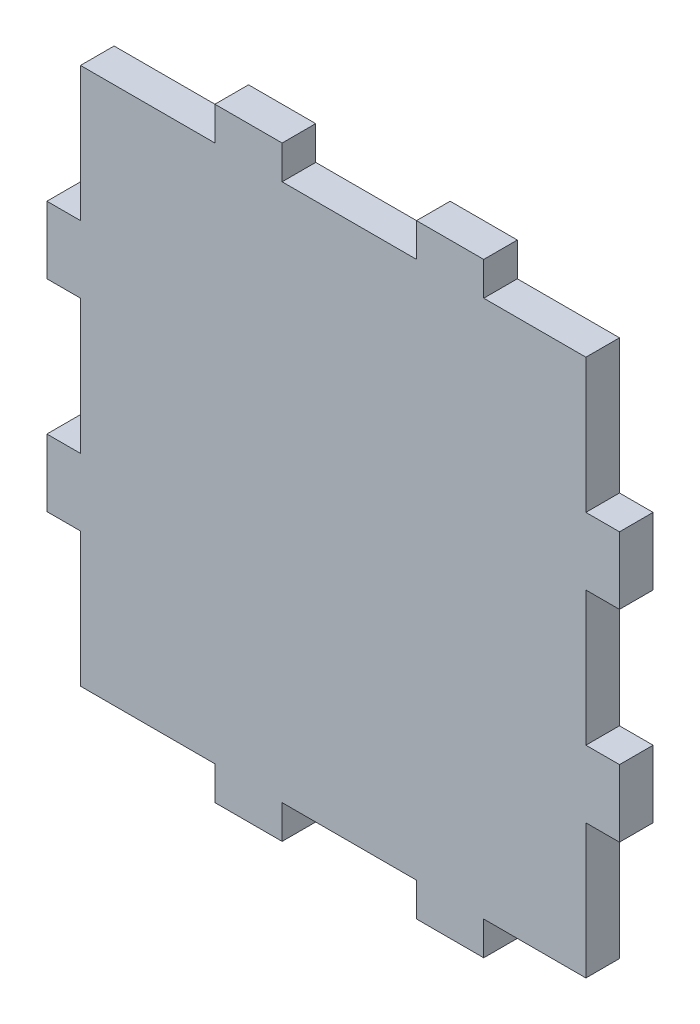
ISO-10303-21;
HEADER;
FILE_DESCRIPTION(('STEP AP214'),'2;1');
FILE_NAME('part.step','',(''),(''),'','','');
FILE_SCHEMA(('AUTOMOTIVE_DESIGN { 1 0 10303 214 1 1 1 1 }'));
ENDSEC;
DATA;
#1=APPLICATION_CONTEXT('core data for automotive mechanical design processes');
#2=APPLICATION_PROTOCOL_DEFINITION('international standard','automotive_design',2000,#1);
#3=PRODUCT_CONTEXT('',#1,'mechanical');
#4=PRODUCT('Part','Part','',(#3));
#5=PRODUCT_RELATED_PRODUCT_CATEGORY('part','',(#4));
#6=PRODUCT_DEFINITION_FORMATION('','',#4);
#7=PRODUCT_DEFINITION_CONTEXT('part definition',#1,'design');
#8=PRODUCT_DEFINITION('design','',#6,#7);
#9=PRODUCT_DEFINITION_SHAPE('','',#8);
#10=(LENGTH_UNIT() NAMED_UNIT(*) SI_UNIT(.MILLI.,.METRE.));
#11=(NAMED_UNIT(*) PLANE_ANGLE_UNIT() SI_UNIT($,.RADIAN.));
#12=(NAMED_UNIT(*) SI_UNIT($,.STERADIAN.) SOLID_ANGLE_UNIT());
#13=UNCERTAINTY_MEASURE_WITH_UNIT(LENGTH_MEASURE(1.E-05),#10,'distance_accuracy_value','');
#14=(GEOMETRIC_REPRESENTATION_CONTEXT(3) GLOBAL_UNCERTAINTY_ASSIGNED_CONTEXT((#13)) GLOBAL_UNIT_ASSIGNED_CONTEXT((#10,
#11,#12)) REPRESENTATION_CONTEXT('',''));
#15=CARTESIAN_POINT('',(0.,0.,0.));
#16=DIRECTION('',(0.,0.,1.));
#17=DIRECTION('',(1.,0.,0.));
#18=AXIS2_PLACEMENT_3D('',#15,#16,#17);
#19=CARTESIAN_POINT('',(-3.175,0.,3.175));
#20=DIRECTION('',(-1.,0.,0.));
#21=DIRECTION('',(0.,0.,1.));
#22=AXIS2_PLACEMENT_3D('',#19,#20,#21);
#23=PLANE('',#22);
#24=DIRECTION('',(0.,1.,0.));
#25=VECTOR('',#24,1.);
#26=CARTESIAN_POINT('',(-3.175,0.,0.));
#27=LINE('',#26,#25);
#28=CARTESIAN_POINT('',(-3.175,-19.05,0.));
#29=VERTEX_POINT('',#28);
#30=CARTESIAN_POINT('',(-3.175,-12.7,0.));
#31=VERTEX_POINT('',#30);
#32=EDGE_CURVE('E297',#29,#31,#27,.T.);
#33=ORIENTED_EDGE('',*,*,#32,.F.);
#34=DIRECTION('',(0.,0.,-1.));
#35=VECTOR('',#34,1.);
#36=CARTESIAN_POINT('',(-3.175,-19.05,3.175));
#37=LINE('',#36,#35);
#38=CARTESIAN_POINT('',(-3.175,-19.05,3.175));
#39=VERTEX_POINT('',#38);
#40=EDGE_CURVE('E11',#39,#29,#37,.T.);
#41=ORIENTED_EDGE('',*,*,#40,.F.);
#42=DIRECTION('',(0.,1.,0.));
#43=VECTOR('',#42,1.);
#44=CARTESIAN_POINT('',(-3.175,0.,3.175));
#45=LINE('',#44,#43);
#46=CARTESIAN_POINT('',(-3.175,-12.7,3.175));
#47=VERTEX_POINT('',#46);
#48=EDGE_CURVE('E394',#39,#47,#45,.T.);
#49=ORIENTED_EDGE('',*,*,#48,.T.);
#50=DIRECTION('',(0.,0.,-1.));
#51=VECTOR('',#50,1.);
#52=CARTESIAN_POINT('',(-3.175,-12.7,3.175));
#53=LINE('',#52,#51);
#54=EDGE_CURVE('E169',#47,#31,#53,.T.);
#55=ORIENTED_EDGE('',*,*,#54,.T.);
#56=EDGE_LOOP('',(#33,#41,#49,#55));
#57=FACE_BOUND('',#56,.T.);
#58=ADVANCED_FACE('F35',(#57),#23,.T.);
#59=CARTESIAN_POINT('',(0.,-19.05,3.175));
#60=DIRECTION('',(0.,-1.,0.));
#61=DIRECTION('',(1.,0.,0.));
#62=AXIS2_PLACEMENT_3D('',#59,#60,#61);
#63=PLANE('',#62);
#64=DIRECTION('',(-1.,0.,0.));
#65=VECTOR('',#64,1.);
#66=CARTESIAN_POINT('',(0.,-19.05,0.));
#67=LINE('',#66,#65);
#68=CARTESIAN_POINT('',(0.,-19.05,0.));
#69=VERTEX_POINT('',#68);
#70=EDGE_CURVE('E300',#69,#29,#67,.T.);
#71=ORIENTED_EDGE('',*,*,#70,.F.);
#72=DIRECTION('',(0.,0.,-1.));
#73=VECTOR('',#72,1.);
#74=CARTESIAN_POINT('',(0.,-19.05,3.175));
#75=LINE('',#74,#73);
#76=CARTESIAN_POINT('',(0.,-19.05,3.175));
#77=VERTEX_POINT('',#76);
#78=EDGE_CURVE('E43',#77,#69,#75,.T.);
#79=ORIENTED_EDGE('',*,*,#78,.F.);
#80=DIRECTION('',(-1.,0.,0.));
#81=VECTOR('',#80,1.);
#82=CARTESIAN_POINT('',(0.,-19.05,3.175));
#83=LINE('',#82,#81);
#84=EDGE_CURVE('E477',#77,#39,#83,.T.);
#85=ORIENTED_EDGE('',*,*,#84,.T.);
#86=ORIENTED_EDGE('',*,*,#40,.T.);
#87=EDGE_LOOP('',(#71,#79,#85,#86));
#88=FACE_BOUND('',#87,.T.);
#89=ADVANCED_FACE('F476',(#88),#63,.T.);
#90=CARTESIAN_POINT('',(0.,0.,3.175));
#91=DIRECTION('',(1.,0.,0.));
#92=DIRECTION('',(0.,1.,0.));
#93=AXIS2_PLACEMENT_3D('',#90,#91,#92);
#94=PLANE('',#93);
#95=DIRECTION('',(0.,-1.,0.));
#96=VECTOR('',#95,1.);
#97=CARTESIAN_POINT('',(0.,0.,0.));
#98=LINE('',#97,#96);
#99=CARTESIAN_POINT('',(0.,-31.75,0.));
#100=VERTEX_POINT('',#99);
#101=EDGE_CURVE('E303',#69,#100,#98,.T.);
#102=ORIENTED_EDGE('',*,*,#101,.T.);
#103=DIRECTION('',(0.,0.,-1.));
#104=VECTOR('',#103,1.);
#105=CARTESIAN_POINT('',(0.,-31.75,3.175));
#106=LINE('',#105,#104);
#107=CARTESIAN_POINT('',(0.,-31.75,3.175));
#108=VERTEX_POINT('',#107);
#109=EDGE_CURVE('E461',#108,#100,#106,.T.);
#110=ORIENTED_EDGE('',*,*,#109,.F.);
#111=DIRECTION('',(0.,-1.,0.));
#112=VECTOR('',#111,1.);
#113=CARTESIAN_POINT('',(0.,0.,3.175));
#114=LINE('',#113,#112);
#115=EDGE_CURVE('E468',#77,#108,#114,.T.);
#116=ORIENTED_EDGE('',*,*,#115,.F.);
#117=ORIENTED_EDGE('',*,*,#78,.T.);
#118=EDGE_LOOP('',(#102,#110,#116,#117));
#119=FACE_BOUND('',#118,.T.);
#120=ADVANCED_FACE('F466',(#119),#94,.F.);
#121=CARTESIAN_POINT('',(0.,-31.75,3.175));
#122=DIRECTION('',(0.,-1.,0.));
#123=DIRECTION('',(0.,0.,-1.));
#124=AXIS2_PLACEMENT_3D('',#121,#122,#123);
#125=PLANE('',#124);
#126=DIRECTION('',(-1.,0.,0.));
#127=VECTOR('',#126,1.);
#128=CARTESIAN_POINT('',(0.,-31.75,0.));
#129=LINE('',#128,#127);
#130=CARTESIAN_POINT('',(-3.175,-31.75,0.));
#131=VERTEX_POINT('',#130);
#132=EDGE_CURVE('E305',#100,#131,#129,.T.);
#133=ORIENTED_EDGE('',*,*,#132,.T.);
#134=DIRECTION('',(0.,0.,-1.));
#135=VECTOR('',#134,1.);
#136=CARTESIAN_POINT('',(-3.175,-31.75,3.175));
#137=LINE('',#136,#135);
#138=CARTESIAN_POINT('',(-3.175,-31.75,3.175));
#139=VERTEX_POINT('',#138);
#140=EDGE_CURVE('E459',#139,#131,#137,.T.);
#141=ORIENTED_EDGE('',*,*,#140,.F.);
#142=DIRECTION('',(-1.,0.,0.));
#143=VECTOR('',#142,1.);
#144=CARTESIAN_POINT('',(0.,-31.75,3.175));
#145=LINE('',#144,#143);
#146=EDGE_CURVE('E485',#108,#139,#145,.T.);
#147=ORIENTED_EDGE('',*,*,#146,.F.);
#148=ORIENTED_EDGE('',*,*,#109,.T.);
#149=EDGE_LOOP('',(#133,#141,#147,#148));
#150=FACE_BOUND('',#149,.T.);
#151=ADVANCED_FACE('F681',(#150),#125,.F.);
#152=CARTESIAN_POINT('',(-3.175,0.,3.175));
#153=DIRECTION('',(-1.,0.,0.));
#154=DIRECTION('',(0.,0.,1.));
#155=AXIS2_PLACEMENT_3D('',#152,#153,#154);
#156=PLANE('',#155);
#157=DIRECTION('',(0.,1.,0.));
#158=VECTOR('',#157,1.);
#159=CARTESIAN_POINT('',(-3.175,0.,0.));
#160=LINE('',#159,#158);
#161=CARTESIAN_POINT('',(-3.175,-38.1,0.));
#162=VERTEX_POINT('',#161);
#163=EDGE_CURVE('E308',#162,#131,#160,.T.);
#164=ORIENTED_EDGE('',*,*,#163,.F.);
#165=DIRECTION('',(0.,0.,-1.));
#166=VECTOR('',#165,1.);
#167=CARTESIAN_POINT('',(-3.175,-38.1,3.175));
#168=LINE('',#167,#166);
#169=CARTESIAN_POINT('',(-3.175,-38.1,3.175));
#170=VERTEX_POINT('',#169);
#171=EDGE_CURVE('E457',#170,#162,#168,.T.);
#172=ORIENTED_EDGE('',*,*,#171,.F.);
#173=DIRECTION('',(0.,1.,0.));
#174=VECTOR('',#173,1.);
#175=CARTESIAN_POINT('',(-3.175,0.,3.175));
#176=LINE('',#175,#174);
#177=EDGE_CURVE('E487',#170,#139,#176,.T.);
#178=ORIENTED_EDGE('',*,*,#177,.T.);
#179=ORIENTED_EDGE('',*,*,#140,.T.);
#180=EDGE_LOOP('',(#164,#172,#178,#179));
#181=FACE_BOUND('',#180,.T.);
#182=ADVANCED_FACE('F677',(#181),#156,.T.);
#183=CARTESIAN_POINT('',(0.,-38.1,3.175));
#184=DIRECTION('',(0.,-1.,0.));
#185=DIRECTION('',(0.,0.,-1.));
#186=AXIS2_PLACEMENT_3D('',#183,#184,#185);
#187=PLANE('',#186);
#188=DIRECTION('',(-1.,0.,0.));
#189=VECTOR('',#188,1.);
#190=CARTESIAN_POINT('',(0.,-38.1,0.));
#191=LINE('',#190,#189);
#192=CARTESIAN_POINT('',(0.,-38.1,0.));
#193=VERTEX_POINT('',#192);
#194=EDGE_CURVE('E311',#193,#162,#191,.T.);
#195=ORIENTED_EDGE('',*,*,#194,.F.);
#196=DIRECTION('',(0.,0.,-1.));
#197=VECTOR('',#196,1.);
#198=CARTESIAN_POINT('',(0.,-38.1,3.175));
#199=LINE('',#198,#197);
#200=CARTESIAN_POINT('',(0.,-38.1,3.175));
#201=VERTEX_POINT('',#200);
#202=EDGE_CURVE('E455',#201,#193,#199,.T.);
#203=ORIENTED_EDGE('',*,*,#202,.F.);
#204=DIRECTION('',(-1.,0.,0.));
#205=VECTOR('',#204,1.);
#206=CARTESIAN_POINT('',(0.,-38.1,3.175));
#207=LINE('',#206,#205);
#208=EDGE_CURVE('E490',#201,#170,#207,.T.);
#209=ORIENTED_EDGE('',*,*,#208,.T.);
#210=ORIENTED_EDGE('',*,*,#171,.T.);
#211=EDGE_LOOP('',(#195,#203,#209,#210));
#212=FACE_BOUND('',#211,.T.);
#213=ADVANCED_FACE('F671',(#212),#187,.T.);
#214=CARTESIAN_POINT('',(0.,0.,3.175));
#215=DIRECTION('',(1.,0.,0.));
#216=DIRECTION('',(0.,1.,0.));
#217=AXIS2_PLACEMENT_3D('',#214,#215,#216);
#218=PLANE('',#217);
#219=DIRECTION('',(0.,-1.,0.));
#220=VECTOR('',#219,1.);
#221=CARTESIAN_POINT('',(0.,0.,0.));
#222=LINE('',#221,#220);
#223=CARTESIAN_POINT('',(0.,-50.8,0.));
#224=VERTEX_POINT('',#223);
#225=EDGE_CURVE('E314',#193,#224,#222,.T.);
#226=ORIENTED_EDGE('',*,*,#225,.T.);
#227=DIRECTION('',(0.,0.,-1.));
#228=VECTOR('',#227,1.);
#229=CARTESIAN_POINT('',(0.,-50.8,3.175));
#230=LINE('',#229,#228);
#231=CARTESIAN_POINT('',(0.,-50.8,3.175));
#232=VERTEX_POINT('',#231);
#233=EDGE_CURVE('E452',#232,#224,#230,.T.);
#234=ORIENTED_EDGE('',*,*,#233,.F.);
#235=DIRECTION('',(0.,-1.,0.));
#236=VECTOR('',#235,1.);
#237=CARTESIAN_POINT('',(0.,0.,3.175));
#238=LINE('',#237,#236);
#239=EDGE_CURVE('E493',#201,#232,#238,.T.);
#240=ORIENTED_EDGE('',*,*,#239,.F.);
#241=ORIENTED_EDGE('',*,*,#202,.T.);
#242=EDGE_LOOP('',(#226,#234,#240,#241));
#243=FACE_BOUND('',#242,.T.);
#244=ADVANCED_FACE('F682',(#243),#218,.F.);
#245=CARTESIAN_POINT('',(0.,-50.8,3.175));
#246=DIRECTION('',(0.,1.,0.));
#247=DIRECTION('',(-1.,0.,0.));
#248=AXIS2_PLACEMENT_3D('',#245,#246,#247);
#249=PLANE('',#248);
#250=DIRECTION('',(1.,0.,0.));
#251=VECTOR('',#250,1.);
#252=CARTESIAN_POINT('',(0.,-50.8,0.));
#253=LINE('',#252,#251);
#254=CARTESIAN_POINT('',(12.7,-50.8,0.));
#255=VERTEX_POINT('',#254);
#256=EDGE_CURVE('E316',#224,#255,#253,.T.);
#257=ORIENTED_EDGE('',*,*,#256,.T.);
#258=DIRECTION('',(0.,0.,-1.));
#259=VECTOR('',#258,1.);
#260=CARTESIAN_POINT('',(12.7,-50.8,3.175));
#261=LINE('',#260,#259);
#262=CARTESIAN_POINT('',(12.7,-50.8,3.175));
#263=VERTEX_POINT('',#262);
#264=EDGE_CURVE('E449',#263,#255,#261,.T.);
#265=ORIENTED_EDGE('',*,*,#264,.F.);
#266=DIRECTION('',(1.,0.,0.));
#267=VECTOR('',#266,1.);
#268=CARTESIAN_POINT('',(0.,-50.8,3.175));
#269=LINE('',#268,#267);
#270=EDGE_CURVE('E495',#232,#263,#269,.T.);
#271=ORIENTED_EDGE('',*,*,#270,.F.);
#272=ORIENTED_EDGE('',*,*,#233,.T.);
#273=EDGE_LOOP('',(#257,#265,#271,#272));
#274=FACE_BOUND('',#273,.T.);
#275=ADVANCED_FACE('F665',(#274),#249,.F.);
#276=CARTESIAN_POINT('',(12.7,0.,3.175));
#277=DIRECTION('',(1.,0.,0.));
#278=DIRECTION('',(0.,0.,-1.));
#279=AXIS2_PLACEMENT_3D('',#276,#277,#278);
#280=PLANE('',#279);
#281=DIRECTION('',(0.,-1.,0.));
#282=VECTOR('',#281,1.);
#283=CARTESIAN_POINT('',(12.7,0.,0.));
#284=LINE('',#283,#282);
#285=CARTESIAN_POINT('',(12.7,-53.975,0.));
#286=VERTEX_POINT('',#285);
#287=EDGE_CURVE('E318',#255,#286,#284,.T.);
#288=ORIENTED_EDGE('',*,*,#287,.T.);
#289=DIRECTION('',(0.,0.,-1.));
#290=VECTOR('',#289,1.);
#291=CARTESIAN_POINT('',(12.7,-53.975,3.175));
#292=LINE('',#291,#290);
#293=CARTESIAN_POINT('',(12.7,-53.975,3.175));
#294=VERTEX_POINT('',#293);
#295=EDGE_CURVE('E446',#294,#286,#292,.T.);
#296=ORIENTED_EDGE('',*,*,#295,.F.);
#297=DIRECTION('',(0.,-1.,0.));
#298=VECTOR('',#297,1.);
#299=CARTESIAN_POINT('',(12.7,0.,3.175));
#300=LINE('',#299,#298);
#301=EDGE_CURVE('E497',#263,#294,#300,.T.);
#302=ORIENTED_EDGE('',*,*,#301,.F.);
#303=ORIENTED_EDGE('',*,*,#264,.T.);
#304=EDGE_LOOP('',(#288,#296,#302,#303));
#305=FACE_BOUND('',#304,.T.);
#306=ADVANCED_FACE('F661',(#305),#280,.F.);
#307=CARTESIAN_POINT('',(0.,-53.975,3.175));
#308=DIRECTION('',(0.,1.,0.));
#309=DIRECTION('',(0.,0.,1.));
#310=AXIS2_PLACEMENT_3D('',#307,#308,#309);
#311=PLANE('',#310);
#312=DIRECTION('',(1.,0.,0.));
#313=VECTOR('',#312,1.);
#314=CARTESIAN_POINT('',(0.,-53.975,0.));
#315=LINE('',#314,#313);
#316=CARTESIAN_POINT('',(19.05,-53.975,0.));
#317=VERTEX_POINT('',#316);
#318=EDGE_CURVE('E320',#286,#317,#315,.T.);
#319=ORIENTED_EDGE('',*,*,#318,.T.);
#320=DIRECTION('',(0.,0.,-1.));
#321=VECTOR('',#320,1.);
#322=CARTESIAN_POINT('',(19.05,-53.975,3.175));
#323=LINE('',#322,#321);
#324=CARTESIAN_POINT('',(19.05,-53.975,3.175));
#325=VERTEX_POINT('',#324);
#326=EDGE_CURVE('E444',#325,#317,#323,.T.);
#327=ORIENTED_EDGE('',*,*,#326,.F.);
#328=DIRECTION('',(1.,0.,0.));
#329=VECTOR('',#328,1.);
#330=CARTESIAN_POINT('',(0.,-53.975,3.175));
#331=LINE('',#330,#329);
#332=EDGE_CURVE('E499',#294,#325,#331,.T.);
#333=ORIENTED_EDGE('',*,*,#332,.F.);
#334=ORIENTED_EDGE('',*,*,#295,.T.);
#335=EDGE_LOOP('',(#319,#327,#333,#334));
#336=FACE_BOUND('',#335,.T.);
#337=ADVANCED_FACE('F656',(#336),#311,.F.);
#338=CARTESIAN_POINT('',(19.05,0.,3.175));
#339=DIRECTION('',(1.,0.,0.));
#340=DIRECTION('',(0.,0.,-1.));
#341=AXIS2_PLACEMENT_3D('',#338,#339,#340);
#342=PLANE('',#341);
#343=DIRECTION('',(0.,-1.,0.));
#344=VECTOR('',#343,1.);
#345=CARTESIAN_POINT('',(19.05,0.,0.));
#346=LINE('',#345,#344);
#347=CARTESIAN_POINT('',(19.05,-50.8,0.));
#348=VERTEX_POINT('',#347);
#349=EDGE_CURVE('E323',#348,#317,#346,.T.);
#350=ORIENTED_EDGE('',*,*,#349,.F.);
#351=DIRECTION('',(0.,0.,-1.));
#352=VECTOR('',#351,1.);
#353=CARTESIAN_POINT('',(19.05,-50.8,3.175));
#354=LINE('',#353,#352);
#355=CARTESIAN_POINT('',(19.05,-50.8,3.175));
#356=VERTEX_POINT('',#355);
#357=EDGE_CURVE('E442',#356,#348,#354,.T.);
#358=ORIENTED_EDGE('',*,*,#357,.F.);
#359=DIRECTION('',(0.,-1.,0.));
#360=VECTOR('',#359,1.);
#361=CARTESIAN_POINT('',(19.05,0.,3.175));
#362=LINE('',#361,#360);
#363=EDGE_CURVE('E501',#356,#325,#362,.T.);
#364=ORIENTED_EDGE('',*,*,#363,.T.);
#365=ORIENTED_EDGE('',*,*,#326,.T.);
#366=EDGE_LOOP('',(#350,#358,#364,#365));
#367=FACE_BOUND('',#366,.T.);
#368=ADVANCED_FACE('F650',(#367),#342,.T.);
#369=CARTESIAN_POINT('',(0.,-50.8,3.175));
#370=DIRECTION('',(0.,1.,0.));
#371=DIRECTION('',(-1.,0.,0.));
#372=AXIS2_PLACEMENT_3D('',#369,#370,#371);
#373=PLANE('',#372);
#374=DIRECTION('',(1.,0.,0.));
#375=VECTOR('',#374,1.);
#376=CARTESIAN_POINT('',(0.,-50.8,0.));
#377=LINE('',#376,#375);
#378=CARTESIAN_POINT('',(31.75,-50.8,0.));
#379=VERTEX_POINT('',#378);
#380=EDGE_CURVE('E326',#348,#379,#377,.T.);
#381=ORIENTED_EDGE('',*,*,#380,.T.);
#382=DIRECTION('',(0.,0.,-1.));
#383=VECTOR('',#382,1.);
#384=CARTESIAN_POINT('',(31.75,-50.8,3.175));
#385=LINE('',#384,#383);
#386=CARTESIAN_POINT('',(31.75,-50.8,3.175));
#387=VERTEX_POINT('',#386);
#388=EDGE_CURVE('E439',#387,#379,#385,.T.);
#389=ORIENTED_EDGE('',*,*,#388,.F.);
#390=DIRECTION('',(1.,0.,0.));
#391=VECTOR('',#390,1.);
#392=CARTESIAN_POINT('',(0.,-50.8,3.175));
#393=LINE('',#392,#391);
#394=EDGE_CURVE('E504',#356,#387,#393,.T.);
#395=ORIENTED_EDGE('',*,*,#394,.F.);
#396=ORIENTED_EDGE('',*,*,#357,.T.);
#397=EDGE_LOOP('',(#381,#389,#395,#396));
#398=FACE_BOUND('',#397,.T.);
#399=ADVANCED_FACE('F647',(#398),#373,.F.);
#400=CARTESIAN_POINT('',(31.75,0.,3.175));
#401=DIRECTION('',(1.,0.,0.));
#402=DIRECTION('',(0.,0.,-1.));
#403=AXIS2_PLACEMENT_3D('',#400,#401,#402);
#404=PLANE('',#403);
#405=DIRECTION('',(0.,-1.,0.));
#406=VECTOR('',#405,1.);
#407=CARTESIAN_POINT('',(31.75,0.,0.));
#408=LINE('',#407,#406);
#409=CARTESIAN_POINT('',(31.75,-53.975,0.));
#410=VERTEX_POINT('',#409);
#411=EDGE_CURVE('E328',#379,#410,#408,.T.);
#412=ORIENTED_EDGE('',*,*,#411,.T.);
#413=DIRECTION('',(0.,0.,-1.));
#414=VECTOR('',#413,1.);
#415=CARTESIAN_POINT('',(31.75,-53.975,3.175));
#416=LINE('',#415,#414);
#417=CARTESIAN_POINT('',(31.75,-53.975,3.175));
#418=VERTEX_POINT('',#417);
#419=EDGE_CURVE('E436',#418,#410,#416,.T.);
#420=ORIENTED_EDGE('',*,*,#419,.F.);
#421=DIRECTION('',(0.,-1.,0.));
#422=VECTOR('',#421,1.);
#423=CARTESIAN_POINT('',(31.75,0.,3.175));
#424=LINE('',#423,#422);
#425=EDGE_CURVE('E506',#387,#418,#424,.T.);
#426=ORIENTED_EDGE('',*,*,#425,.F.);
#427=ORIENTED_EDGE('',*,*,#388,.T.);
#428=EDGE_LOOP('',(#412,#420,#426,#427));
#429=FACE_BOUND('',#428,.T.);
#430=ADVANCED_FACE('F642',(#429),#404,.F.);
#431=CARTESIAN_POINT('',(0.,-53.975,3.175));
#432=DIRECTION('',(0.,1.,0.));
#433=DIRECTION('',(0.,0.,1.));
#434=AXIS2_PLACEMENT_3D('',#431,#432,#433);
#435=PLANE('',#434);
#436=DIRECTION('',(1.,0.,0.));
#437=VECTOR('',#436,1.);
#438=CARTESIAN_POINT('',(0.,-53.975,0.));
#439=LINE('',#438,#437);
#440=CARTESIAN_POINT('',(38.1,-53.975,0.));
#441=VERTEX_POINT('',#440);
#442=EDGE_CURVE('E330',#410,#441,#439,.T.);
#443=ORIENTED_EDGE('',*,*,#442,.T.);
#444=DIRECTION('',(0.,0.,-1.));
#445=VECTOR('',#444,1.);
#446=CARTESIAN_POINT('',(38.1,-53.975,3.175));
#447=LINE('',#446,#445);
#448=CARTESIAN_POINT('',(38.1,-53.975,3.175));
#449=VERTEX_POINT('',#448);
#450=EDGE_CURVE('E434',#449,#441,#447,.T.);
#451=ORIENTED_EDGE('',*,*,#450,.F.);
#452=DIRECTION('',(1.,0.,0.));
#453=VECTOR('',#452,1.);
#454=CARTESIAN_POINT('',(0.,-53.975,3.175));
#455=LINE('',#454,#453);
#456=EDGE_CURVE('E508',#418,#449,#455,.T.);
#457=ORIENTED_EDGE('',*,*,#456,.F.);
#458=ORIENTED_EDGE('',*,*,#419,.T.);
#459=EDGE_LOOP('',(#443,#451,#457,#458));
#460=FACE_BOUND('',#459,.T.);
#461=ADVANCED_FACE('F636',(#460),#435,.F.);
#462=CARTESIAN_POINT('',(38.1,0.,3.175));
#463=DIRECTION('',(1.,0.,0.));
#464=DIRECTION('',(0.,0.,-1.));
#465=AXIS2_PLACEMENT_3D('',#462,#463,#464);
#466=PLANE('',#465);
#467=DIRECTION('',(0.,-1.,0.));
#468=VECTOR('',#467,1.);
#469=CARTESIAN_POINT('',(38.1,0.,0.));
#470=LINE('',#469,#468);
#471=CARTESIAN_POINT('',(38.1,-50.8,0.));
#472=VERTEX_POINT('',#471);
#473=EDGE_CURVE('E333',#472,#441,#470,.T.);
#474=ORIENTED_EDGE('',*,*,#473,.F.);
#475=DIRECTION('',(0.,0.,-1.));
#476=VECTOR('',#475,1.);
#477=CARTESIAN_POINT('',(38.1,-50.8,3.175));
#478=LINE('',#477,#476);
#479=CARTESIAN_POINT('',(38.1,-50.8,3.175));
#480=VERTEX_POINT('',#479);
#481=EDGE_CURVE('E432',#480,#472,#478,.T.);
#482=ORIENTED_EDGE('',*,*,#481,.F.);
#483=DIRECTION('',(0.,-1.,0.));
#484=VECTOR('',#483,1.);
#485=CARTESIAN_POINT('',(38.1,0.,3.175));
#486=LINE('',#485,#484);
#487=EDGE_CURVE('E510',#480,#449,#486,.T.);
#488=ORIENTED_EDGE('',*,*,#487,.T.);
#489=ORIENTED_EDGE('',*,*,#450,.T.);
#490=EDGE_LOOP('',(#474,#482,#488,#489));
#491=FACE_BOUND('',#490,.T.);
#492=ADVANCED_FACE('F630',(#491),#466,.T.);
#493=CARTESIAN_POINT('',(0.,-50.8,3.175));
#494=DIRECTION('',(0.,1.,0.));
#495=DIRECTION('',(0.,0.,1.));
#496=AXIS2_PLACEMENT_3D('',#493,#494,#495);
#497=PLANE('',#496);
#498=DIRECTION('',(1.,0.,0.));
#499=VECTOR('',#498,1.);
#500=CARTESIAN_POINT('',(0.,-50.8,0.));
#501=LINE('',#500,#499);
#502=CARTESIAN_POINT('',(47.752,-50.8,0.));
#503=VERTEX_POINT('',#502);
#504=EDGE_CURVE('E336',#472,#503,#501,.T.);
#505=ORIENTED_EDGE('',*,*,#504,.T.);
#506=DIRECTION('',(0.,0.,-1.));
#507=VECTOR('',#506,1.);
#508=CARTESIAN_POINT('',(47.752,-50.8,3.175));
#509=LINE('',#508,#507);
#510=CARTESIAN_POINT('',(47.752,-50.8,3.175));
#511=VERTEX_POINT('',#510);
#512=EDGE_CURVE('E430',#511,#503,#509,.T.);
#513=ORIENTED_EDGE('',*,*,#512,.F.);
#514=DIRECTION('',(1.,0.,0.));
#515=VECTOR('',#514,1.);
#516=CARTESIAN_POINT('',(0.,-50.8,3.175));
#517=LINE('',#516,#515);
#518=EDGE_CURVE('E513',#480,#511,#517,.T.);
#519=ORIENTED_EDGE('',*,*,#518,.F.);
#520=ORIENTED_EDGE('',*,*,#481,.T.);
#521=EDGE_LOOP('',(#505,#513,#519,#520));
#522=FACE_BOUND('',#521,.T.);
#523=ADVANCED_FACE('F778',(#522),#497,.F.);
#524=CARTESIAN_POINT('',(47.752,0.,3.175));
#525=DIRECTION('',(1.,0.,0.));
#526=DIRECTION('',(0.,0.,-1.));
#527=AXIS2_PLACEMENT_3D('',#524,#525,#526);
#528=PLANE('',#527);
#529=DIRECTION('',(0.,-1.,0.));
#530=VECTOR('',#529,1.);
#531=CARTESIAN_POINT('',(47.752,0.,0.));
#532=LINE('',#531,#530);
#533=CARTESIAN_POINT('',(47.752,-38.1,0.));
#534=VERTEX_POINT('',#533);
#535=EDGE_CURVE('E339',#534,#503,#532,.T.);
#536=ORIENTED_EDGE('',*,*,#535,.F.);
#537=DIRECTION('',(0.,0.,-1.));
#538=VECTOR('',#537,1.);
#539=CARTESIAN_POINT('',(47.752,-38.1,3.175));
#540=LINE('',#539,#538);
#541=CARTESIAN_POINT('',(47.752,-38.1,3.175));
#542=VERTEX_POINT('',#541);
#543=EDGE_CURVE('E428',#542,#534,#540,.T.);
#544=ORIENTED_EDGE('',*,*,#543,.F.);
#545=DIRECTION('',(0.,-1.,0.));
#546=VECTOR('',#545,1.);
#547=CARTESIAN_POINT('',(47.752,0.,3.175));
#548=LINE('',#547,#546);
#549=EDGE_CURVE('E515',#542,#511,#548,.T.);
#550=ORIENTED_EDGE('',*,*,#549,.T.);
#551=ORIENTED_EDGE('',*,*,#512,.T.);
#552=EDGE_LOOP('',(#536,#544,#550,#551));
#553=FACE_BOUND('',#552,.T.);
#554=ADVANCED_FACE('F623',(#553),#528,.T.);
#555=CARTESIAN_POINT('',(0.,-38.1,3.175));
#556=DIRECTION('',(0.,1.,0.));
#557=DIRECTION('',(0.,0.,1.));
#558=AXIS2_PLACEMENT_3D('',#555,#556,#557);
#559=PLANE('',#558);
#560=DIRECTION('',(1.,0.,0.));
#561=VECTOR('',#560,1.);
#562=CARTESIAN_POINT('',(0.,-38.1,0.));
#563=LINE('',#562,#561);
#564=CARTESIAN_POINT('',(50.927,-38.1,0.));
#565=VERTEX_POINT('',#564);
#566=EDGE_CURVE('E342',#534,#565,#563,.T.);
#567=ORIENTED_EDGE('',*,*,#566,.T.);
#568=DIRECTION('',(0.,0.,-1.));
#569=VECTOR('',#568,1.);
#570=CARTESIAN_POINT('',(50.927,-38.1,3.175));
#571=LINE('',#570,#569);
#572=CARTESIAN_POINT('',(50.927,-38.1,3.175));
#573=VERTEX_POINT('',#572);
#574=EDGE_CURVE('E426',#573,#565,#571,.T.);
#575=ORIENTED_EDGE('',*,*,#574,.F.);
#576=DIRECTION('',(1.,0.,0.));
#577=VECTOR('',#576,1.);
#578=CARTESIAN_POINT('',(0.,-38.1,3.175));
#579=LINE('',#578,#577);
#580=EDGE_CURVE('E518',#542,#573,#579,.T.);
#581=ORIENTED_EDGE('',*,*,#580,.F.);
#582=ORIENTED_EDGE('',*,*,#543,.T.);
#583=EDGE_LOOP('',(#567,#575,#581,#582));
#584=FACE_BOUND('',#583,.T.);
#585=ADVANCED_FACE('F620',(#584),#559,.F.);
#586=CARTESIAN_POINT('',(50.927,0.,3.175));
#587=DIRECTION('',(1.,0.,0.));
#588=DIRECTION('',(0.,1.,0.));
#589=AXIS2_PLACEMENT_3D('',#586,#587,#588);
#590=PLANE('',#589);
#591=DIRECTION('',(0.,-1.,0.));
#592=VECTOR('',#591,1.);
#593=CARTESIAN_POINT('',(50.927,0.,0.));
#594=LINE('',#593,#592);
#595=CARTESIAN_POINT('',(50.927,-31.75,0.));
#596=VERTEX_POINT('',#595);
#597=EDGE_CURVE('E345',#596,#565,#594,.T.);
#598=ORIENTED_EDGE('',*,*,#597,.F.);
#599=DIRECTION('',(0.,0.,-1.));
#600=VECTOR('',#599,1.);
#601=CARTESIAN_POINT('',(50.927,-31.75,3.175));
#602=LINE('',#601,#600);
#603=CARTESIAN_POINT('',(50.927,-31.75,3.175));
#604=VERTEX_POINT('',#603);
#605=EDGE_CURVE('E424',#604,#596,#602,.T.);
#606=ORIENTED_EDGE('',*,*,#605,.F.);
#607=DIRECTION('',(0.,-1.,0.));
#608=VECTOR('',#607,1.);
#609=CARTESIAN_POINT('',(50.927,0.,3.175));
#610=LINE('',#609,#608);
#611=EDGE_CURVE('E520',#604,#573,#610,.T.);
#612=ORIENTED_EDGE('',*,*,#611,.T.);
#613=ORIENTED_EDGE('',*,*,#574,.T.);
#614=EDGE_LOOP('',(#598,#606,#612,#613));
#615=FACE_BOUND('',#614,.T.);
#616=ADVANCED_FACE('F615',(#615),#590,.T.);
#617=CARTESIAN_POINT('',(0.,-31.75,3.175));
#618=DIRECTION('',(0.,1.,0.));
#619=DIRECTION('',(0.,0.,1.));
#620=AXIS2_PLACEMENT_3D('',#617,#618,#619);
#621=PLANE('',#620);
#622=DIRECTION('',(1.,0.,0.));
#623=VECTOR('',#622,1.);
#624=CARTESIAN_POINT('',(0.,-31.75,0.));
#625=LINE('',#624,#623);
#626=CARTESIAN_POINT('',(47.752,-31.75,0.));
#627=VERTEX_POINT('',#626);
#628=EDGE_CURVE('E348',#627,#596,#625,.T.);
#629=ORIENTED_EDGE('',*,*,#628,.F.);
#630=DIRECTION('',(0.,0.,-1.));
#631=VECTOR('',#630,1.);
#632=CARTESIAN_POINT('',(47.752,-31.75,3.175));
#633=LINE('',#632,#631);
#634=CARTESIAN_POINT('',(47.752,-31.75,3.175));
#635=VERTEX_POINT('',#634);
#636=EDGE_CURVE('E422',#635,#627,#633,.T.);
#637=ORIENTED_EDGE('',*,*,#636,.F.);
#638=DIRECTION('',(1.,0.,0.));
#639=VECTOR('',#638,1.);
#640=CARTESIAN_POINT('',(0.,-31.75,3.175));
#641=LINE('',#640,#639);
#642=EDGE_CURVE('E523',#635,#604,#641,.T.);
#643=ORIENTED_EDGE('',*,*,#642,.T.);
#644=ORIENTED_EDGE('',*,*,#605,.T.);
#645=EDGE_LOOP('',(#629,#637,#643,#644));
#646=FACE_BOUND('',#645,.T.);
#647=ADVANCED_FACE('F610',(#646),#621,.T.);
#648=CARTESIAN_POINT('',(47.752,0.,3.175));
#649=DIRECTION('',(1.,0.,0.));
#650=DIRECTION('',(0.,1.,0.));
#651=AXIS2_PLACEMENT_3D('',#648,#649,#650);
#652=PLANE('',#651);
#653=DIRECTION('',(0.,-1.,0.));
#654=VECTOR('',#653,1.);
#655=CARTESIAN_POINT('',(47.752,0.,0.));
#656=LINE('',#655,#654);
#657=CARTESIAN_POINT('',(47.752,-19.05,0.));
#658=VERTEX_POINT('',#657);
#659=EDGE_CURVE('E351',#658,#627,#656,.T.);
#660=ORIENTED_EDGE('',*,*,#659,.F.);
#661=DIRECTION('',(0.,0.,-1.));
#662=VECTOR('',#661,1.);
#663=CARTESIAN_POINT('',(47.752,-19.05,3.175));
#664=LINE('',#663,#662);
#665=CARTESIAN_POINT('',(47.752,-19.05,3.175));
#666=VERTEX_POINT('',#665);
#667=EDGE_CURVE('E420',#666,#658,#664,.T.);
#668=ORIENTED_EDGE('',*,*,#667,.F.);
#669=DIRECTION('',(0.,-1.,0.));
#670=VECTOR('',#669,1.);
#671=CARTESIAN_POINT('',(47.752,0.,3.175));
#672=LINE('',#671,#670);
#673=EDGE_CURVE('E526',#666,#635,#672,.T.);
#674=ORIENTED_EDGE('',*,*,#673,.T.);
#675=ORIENTED_EDGE('',*,*,#636,.T.);
#676=EDGE_LOOP('',(#660,#668,#674,#675));
#677=FACE_BOUND('',#676,.T.);
#678=ADVANCED_FACE('F604',(#677),#652,.T.);
#679=CARTESIAN_POINT('',(0.,-19.05,3.175));
#680=DIRECTION('',(0.,1.,0.));
#681=DIRECTION('',(0.,0.,1.));
#682=AXIS2_PLACEMENT_3D('',#679,#680,#681);
#683=PLANE('',#682);
#684=DIRECTION('',(1.,0.,0.));
#685=VECTOR('',#684,1.);
#686=CARTESIAN_POINT('',(0.,-19.05,0.));
#687=LINE('',#686,#685);
#688=CARTESIAN_POINT('',(50.927,-19.05,0.));
#689=VERTEX_POINT('',#688);
#690=EDGE_CURVE('E354',#658,#689,#687,.T.);
#691=ORIENTED_EDGE('',*,*,#690,.T.);
#692=DIRECTION('',(0.,0.,-1.));
#693=VECTOR('',#692,1.);
#694=CARTESIAN_POINT('',(50.927,-19.05,3.175));
#695=LINE('',#694,#693);
#696=CARTESIAN_POINT('',(50.927,-19.05,3.175));
#697=VERTEX_POINT('',#696);
#698=EDGE_CURVE('E418',#697,#689,#695,.T.);
#699=ORIENTED_EDGE('',*,*,#698,.F.);
#700=DIRECTION('',(1.,0.,0.));
#701=VECTOR('',#700,1.);
#702=CARTESIAN_POINT('',(0.,-19.05,3.175));
#703=LINE('',#702,#701);
#704=EDGE_CURVE('E529',#666,#697,#703,.T.);
#705=ORIENTED_EDGE('',*,*,#704,.F.);
#706=ORIENTED_EDGE('',*,*,#667,.T.);
#707=EDGE_LOOP('',(#691,#699,#705,#706));
#708=FACE_BOUND('',#707,.T.);
#709=ADVANCED_FACE('F827',(#708),#683,.F.);
#710=CARTESIAN_POINT('',(50.927,0.,3.175));
#711=DIRECTION('',(1.,0.,0.));
#712=DIRECTION('',(0.,0.,-1.));
#713=AXIS2_PLACEMENT_3D('',#710,#711,#712);
#714=PLANE('',#713);
#715=DIRECTION('',(0.,-1.,0.));
#716=VECTOR('',#715,1.);
#717=CARTESIAN_POINT('',(50.927,0.,0.));
#718=LINE('',#717,#716);
#719=CARTESIAN_POINT('',(50.927,-12.7,0.));
#720=VERTEX_POINT('',#719);
#721=EDGE_CURVE('E357',#720,#689,#718,.T.);
#722=ORIENTED_EDGE('',*,*,#721,.F.);
#723=DIRECTION('',(0.,0.,-1.));
#724=VECTOR('',#723,1.);
#725=CARTESIAN_POINT('',(50.927,-12.7,3.175));
#726=LINE('',#725,#724);
#727=CARTESIAN_POINT('',(50.927,-12.7,3.175));
#728=VERTEX_POINT('',#727);
#729=EDGE_CURVE('E416',#728,#720,#726,.T.);
#730=ORIENTED_EDGE('',*,*,#729,.F.);
#731=DIRECTION('',(0.,-1.,0.));
#732=VECTOR('',#731,1.);
#733=CARTESIAN_POINT('',(50.927,0.,3.175));
#734=LINE('',#733,#732);
#735=EDGE_CURVE('E531',#728,#697,#734,.T.);
#736=ORIENTED_EDGE('',*,*,#735,.T.);
#737=ORIENTED_EDGE('',*,*,#698,.T.);
#738=EDGE_LOOP('',(#722,#730,#736,#737));
#739=FACE_BOUND('',#738,.T.);
#740=ADVANCED_FACE('F598',(#739),#714,.T.);
#741=CARTESIAN_POINT('',(0.,-12.7,3.175));
#742=DIRECTION('',(0.,1.,0.));
#743=DIRECTION('',(0.,0.,1.));
#744=AXIS2_PLACEMENT_3D('',#741,#742,#743);
#745=PLANE('',#744);
#746=DIRECTION('',(1.,0.,0.));
#747=VECTOR('',#746,1.);
#748=CARTESIAN_POINT('',(0.,-12.7,0.));
#749=LINE('',#748,#747);
#750=CARTESIAN_POINT('',(47.752,-12.7,0.));
#751=VERTEX_POINT('',#750);
#752=EDGE_CURVE('E360',#751,#720,#749,.T.);
#753=ORIENTED_EDGE('',*,*,#752,.F.);
#754=DIRECTION('',(0.,0.,-1.));
#755=VECTOR('',#754,1.);
#756=CARTESIAN_POINT('',(47.752,-12.7,3.175));
#757=LINE('',#756,#755);
#758=CARTESIAN_POINT('',(47.752,-12.7,3.175));
#759=VERTEX_POINT('',#758);
#760=EDGE_CURVE('E414',#759,#751,#757,.T.);
#761=ORIENTED_EDGE('',*,*,#760,.F.);
#762=DIRECTION('',(1.,0.,0.));
#763=VECTOR('',#762,1.);
#764=CARTESIAN_POINT('',(0.,-12.7,3.175));
#765=LINE('',#764,#763);
#766=EDGE_CURVE('E534',#759,#728,#765,.T.);
#767=ORIENTED_EDGE('',*,*,#766,.T.);
#768=ORIENTED_EDGE('',*,*,#729,.T.);
#769=EDGE_LOOP('',(#753,#761,#767,#768));
#770=FACE_BOUND('',#769,.T.);
#771=ADVANCED_FACE('F594',(#770),#745,.T.);
#772=CARTESIAN_POINT('',(47.752,0.,3.175));
#773=DIRECTION('',(1.,0.,0.));
#774=DIRECTION('',(0.,0.,-1.));
#775=AXIS2_PLACEMENT_3D('',#772,#773,#774);
#776=PLANE('',#775);
#777=DIRECTION('',(0.,-1.,0.));
#778=VECTOR('',#777,1.);
#779=CARTESIAN_POINT('',(47.752,0.,0.));
#780=LINE('',#779,#778);
#781=CARTESIAN_POINT('',(47.752,0.,0.));
#782=VERTEX_POINT('',#781);
#783=EDGE_CURVE('E363',#782,#751,#780,.T.);
#784=ORIENTED_EDGE('',*,*,#783,.F.);
#785=DIRECTION('',(0.,0.,-1.));
#786=VECTOR('',#785,1.);
#787=CARTESIAN_POINT('',(47.752,0.,3.175));
#788=LINE('',#787,#786);
#789=CARTESIAN_POINT('',(47.752,0.,3.175));
#790=VERTEX_POINT('',#789);
#791=EDGE_CURVE('E412',#790,#782,#788,.T.);
#792=ORIENTED_EDGE('',*,*,#791,.F.);
#793=DIRECTION('',(0.,-1.,0.));
#794=VECTOR('',#793,1.);
#795=CARTESIAN_POINT('',(47.752,0.,3.175));
#796=LINE('',#795,#794);
#797=EDGE_CURVE('E537',#790,#759,#796,.T.);
#798=ORIENTED_EDGE('',*,*,#797,.T.);
#799=ORIENTED_EDGE('',*,*,#760,.T.);
#800=EDGE_LOOP('',(#784,#792,#798,#799));
#801=FACE_BOUND('',#800,.T.);
#802=ADVANCED_FACE('F590',(#801),#776,.T.);
#803=CARTESIAN_POINT('',(0.,0.,3.175));
#804=DIRECTION('',(0.,1.,0.));
#805=DIRECTION('',(-1.,0.,0.));
#806=AXIS2_PLACEMENT_3D('',#803,#804,#805);
#807=PLANE('',#806);
#808=DIRECTION('',(1.,0.,0.));
#809=VECTOR('',#808,1.);
#810=CARTESIAN_POINT('',(0.,0.,0.));
#811=LINE('',#810,#809);
#812=CARTESIAN_POINT('',(38.1,0.,0.));
#813=VERTEX_POINT('',#812);
#814=EDGE_CURVE('E366',#813,#782,#811,.T.);
#815=ORIENTED_EDGE('',*,*,#814,.F.);
#816=DIRECTION('',(0.,0.,-1.));
#817=VECTOR('',#816,1.);
#818=CARTESIAN_POINT('',(38.1,0.,3.175));
#819=LINE('',#818,#817);
#820=CARTESIAN_POINT('',(38.1,0.,3.175));
#821=VERTEX_POINT('',#820);
#822=EDGE_CURVE('E410',#821,#813,#819,.T.);
#823=ORIENTED_EDGE('',*,*,#822,.F.);
#824=DIRECTION('',(1.,0.,0.));
#825=VECTOR('',#824,1.);
#826=CARTESIAN_POINT('',(0.,0.,3.175));
#827=LINE('',#826,#825);
#828=EDGE_CURVE('E540',#821,#790,#827,.T.);
#829=ORIENTED_EDGE('',*,*,#828,.T.);
#830=ORIENTED_EDGE('',*,*,#791,.T.);
#831=EDGE_LOOP('',(#815,#823,#829,#830));
#832=FACE_BOUND('',#831,.T.);
#833=ADVANCED_FACE('F586',(#832),#807,.T.);
#834=CARTESIAN_POINT('',(38.1,0.,3.175));
#835=DIRECTION('',(-1.,0.,0.));
#836=DIRECTION('',(0.,0.,1.));
#837=AXIS2_PLACEMENT_3D('',#834,#835,#836);
#838=PLANE('',#837);
#839=DIRECTION('',(0.,1.,0.));
#840=VECTOR('',#839,1.);
#841=CARTESIAN_POINT('',(38.1,0.,0.));
#842=LINE('',#841,#840);
#843=CARTESIAN_POINT('',(38.1,3.175,0.));
#844=VERTEX_POINT('',#843);
#845=EDGE_CURVE('E369',#813,#844,#842,.T.);
#846=ORIENTED_EDGE('',*,*,#845,.T.);
#847=DIRECTION('',(0.,0.,-1.));
#848=VECTOR('',#847,1.);
#849=CARTESIAN_POINT('',(38.1,3.175,3.175));
#850=LINE('',#849,#848);
#851=CARTESIAN_POINT('',(38.1,3.175,3.175));
#852=VERTEX_POINT('',#851);
#853=EDGE_CURVE('E408',#852,#844,#850,.T.);
#854=ORIENTED_EDGE('',*,*,#853,.F.);
#855=DIRECTION('',(0.,1.,0.));
#856=VECTOR('',#855,1.);
#857=CARTESIAN_POINT('',(38.1,0.,3.175));
#858=LINE('',#857,#856);
#859=EDGE_CURVE('E543',#821,#852,#858,.T.);
#860=ORIENTED_EDGE('',*,*,#859,.F.);
#861=ORIENTED_EDGE('',*,*,#822,.T.);
#862=EDGE_LOOP('',(#846,#854,#860,#861));
#863=FACE_BOUND('',#862,.T.);
#864=ADVANCED_FACE('F583',(#863),#838,.F.);
#865=CARTESIAN_POINT('',(0.,3.17499999999999,3.175));
#866=DIRECTION('',(0.,1.,0.));
#867=DIRECTION('',(-1.,0.,0.));
#868=AXIS2_PLACEMENT_3D('',#865,#866,#867);
#869=PLANE('',#868);
#870=DIRECTION('',(1.,0.,0.));
#871=VECTOR('',#870,1.);
#872=CARTESIAN_POINT('',(0.,3.17499999999999,0.));
#873=LINE('',#872,#871);
#874=CARTESIAN_POINT('',(31.75,3.17499999999999,0.));
#875=VERTEX_POINT('',#874);
#876=EDGE_CURVE('E372',#875,#844,#873,.T.);
#877=ORIENTED_EDGE('',*,*,#876,.F.);
#878=DIRECTION('',(0.,0.,-1.));
#879=VECTOR('',#878,1.);
#880=CARTESIAN_POINT('',(31.75,3.17499999999999,3.175));
#881=LINE('',#880,#879);
#882=CARTESIAN_POINT('',(31.75,3.17499999999999,3.175));
#883=VERTEX_POINT('',#882);
#884=EDGE_CURVE('E406',#883,#875,#881,.T.);
#885=ORIENTED_EDGE('',*,*,#884,.F.);
#886=DIRECTION('',(1.,0.,0.));
#887=VECTOR('',#886,1.);
#888=CARTESIAN_POINT('',(0.,3.17499999999999,3.175));
#889=LINE('',#888,#887);
#890=EDGE_CURVE('E545',#883,#852,#889,.T.);
#891=ORIENTED_EDGE('',*,*,#890,.T.);
#892=ORIENTED_EDGE('',*,*,#853,.T.);
#893=EDGE_LOOP('',(#877,#885,#891,#892));
#894=FACE_BOUND('',#893,.T.);
#895=ADVANCED_FACE('F578',(#894),#869,.T.);
#896=CARTESIAN_POINT('',(31.75,0.,3.175));
#897=DIRECTION('',(-1.,0.,0.));
#898=DIRECTION('',(0.,0.,1.));
#899=AXIS2_PLACEMENT_3D('',#896,#897,#898);
#900=PLANE('',#899);
#901=DIRECTION('',(0.,1.,0.));
#902=VECTOR('',#901,1.);
#903=CARTESIAN_POINT('',(31.75,0.,0.));
#904=LINE('',#903,#902);
#905=CARTESIAN_POINT('',(31.75,0.,0.));
#906=VERTEX_POINT('',#905);
#907=EDGE_CURVE('E375',#906,#875,#904,.T.);
#908=ORIENTED_EDGE('',*,*,#907,.F.);
#909=DIRECTION('',(0.,0.,-1.));
#910=VECTOR('',#909,1.);
#911=CARTESIAN_POINT('',(31.75,0.,3.175));
#912=LINE('',#911,#910);
#913=CARTESIAN_POINT('',(31.75,0.,3.175));
#914=VERTEX_POINT('',#913);
#915=EDGE_CURVE('E404',#914,#906,#912,.T.);
#916=ORIENTED_EDGE('',*,*,#915,.F.);
#917=DIRECTION('',(0.,1.,0.));
#918=VECTOR('',#917,1.);
#919=CARTESIAN_POINT('',(31.75,0.,3.175));
#920=LINE('',#919,#918);
#921=EDGE_CURVE('E548',#914,#883,#920,.T.);
#922=ORIENTED_EDGE('',*,*,#921,.T.);
#923=ORIENTED_EDGE('',*,*,#884,.T.);
#924=EDGE_LOOP('',(#908,#916,#922,#923));
#925=FACE_BOUND('',#924,.T.);
#926=ADVANCED_FACE('F573',(#925),#900,.T.);
#927=CARTESIAN_POINT('',(0.,0.,3.175));
#928=DIRECTION('',(0.,1.,0.));
#929=DIRECTION('',(-1.,0.,0.));
#930=AXIS2_PLACEMENT_3D('',#927,#928,#929);
#931=PLANE('',#930);
#932=DIRECTION('',(1.,0.,0.));
#933=VECTOR('',#932,1.);
#934=CARTESIAN_POINT('',(0.,0.,0.));
#935=LINE('',#934,#933);
#936=CARTESIAN_POINT('',(19.05,0.,0.));
#937=VERTEX_POINT('',#936);
#938=EDGE_CURVE('E378',#937,#906,#935,.T.);
#939=ORIENTED_EDGE('',*,*,#938,.F.);
#940=DIRECTION('',(0.,0.,-1.));
#941=VECTOR('',#940,1.);
#942=CARTESIAN_POINT('',(19.05,0.,3.175));
#943=LINE('',#942,#941);
#944=CARTESIAN_POINT('',(19.05,0.,3.175));
#945=VERTEX_POINT('',#944);
#946=EDGE_CURVE('E402',#945,#937,#943,.T.);
#947=ORIENTED_EDGE('',*,*,#946,.F.);
#948=DIRECTION('',(1.,0.,0.));
#949=VECTOR('',#948,1.);
#950=CARTESIAN_POINT('',(0.,0.,3.175));
#951=LINE('',#950,#949);
#952=EDGE_CURVE('E551',#945,#914,#951,.T.);
#953=ORIENTED_EDGE('',*,*,#952,.T.);
#954=ORIENTED_EDGE('',*,*,#915,.T.);
#955=EDGE_LOOP('',(#939,#947,#953,#954));
#956=FACE_BOUND('',#955,.T.);
#957=ADVANCED_FACE('F569',(#956),#931,.T.);
#958=CARTESIAN_POINT('',(19.05,0.,3.175));
#959=DIRECTION('',(-1.,0.,0.));
#960=DIRECTION('',(0.,0.,1.));
#961=AXIS2_PLACEMENT_3D('',#958,#959,#960);
#962=PLANE('',#961);
#963=DIRECTION('',(0.,1.,0.));
#964=VECTOR('',#963,1.);
#965=CARTESIAN_POINT('',(19.05,0.,0.));
#966=LINE('',#965,#964);
#967=CARTESIAN_POINT('',(19.05,3.175,0.));
#968=VERTEX_POINT('',#967);
#969=EDGE_CURVE('E381',#937,#968,#966,.T.);
#970=ORIENTED_EDGE('',*,*,#969,.T.);
#971=DIRECTION('',(0.,0.,-1.));
#972=VECTOR('',#971,1.);
#973=CARTESIAN_POINT('',(19.05,3.175,3.175));
#974=LINE('',#973,#972);
#975=CARTESIAN_POINT('',(19.05,3.175,3.175));
#976=VERTEX_POINT('',#975);
#977=EDGE_CURVE('E400',#976,#968,#974,.T.);
#978=ORIENTED_EDGE('',*,*,#977,.F.);
#979=DIRECTION('',(0.,1.,0.));
#980=VECTOR('',#979,1.);
#981=CARTESIAN_POINT('',(19.05,0.,3.175));
#982=LINE('',#981,#980);
#983=EDGE_CURVE('E554',#945,#976,#982,.T.);
#984=ORIENTED_EDGE('',*,*,#983,.F.);
#985=ORIENTED_EDGE('',*,*,#946,.T.);
#986=EDGE_LOOP('',(#970,#978,#984,#985));
#987=FACE_BOUND('',#986,.T.);
#988=ADVANCED_FACE('F900',(#987),#962,.F.);
#989=CARTESIAN_POINT('',(0.,3.175,3.175));
#990=DIRECTION('',(0.,1.,0.));
#991=DIRECTION('',(-1.,0.,0.));
#992=AXIS2_PLACEMENT_3D('',#989,#990,#991);
#993=PLANE('',#992);
#994=DIRECTION('',(1.,0.,0.));
#995=VECTOR('',#994,1.);
#996=CARTESIAN_POINT('',(0.,3.175,0.));
#997=LINE('',#996,#995);
#998=CARTESIAN_POINT('',(12.7,3.175,0.));
#999=VERTEX_POINT('',#998);
#1000=EDGE_CURVE('E384',#999,#968,#997,.T.);
#1001=ORIENTED_EDGE('',*,*,#1000,.F.);
#1002=DIRECTION('',(0.,0.,-1.));
#1003=VECTOR('',#1002,1.);
#1004=CARTESIAN_POINT('',(12.7,3.175,3.175));
#1005=LINE('',#1004,#1003);
#1006=CARTESIAN_POINT('',(12.7,3.175,3.175));
#1007=VERTEX_POINT('',#1006);
#1008=EDGE_CURVE('E398',#1007,#999,#1005,.T.);
#1009=ORIENTED_EDGE('',*,*,#1008,.F.);
#1010=DIRECTION('',(1.,0.,0.));
#1011=VECTOR('',#1010,1.);
#1012=CARTESIAN_POINT('',(0.,3.175,3.175));
#1013=LINE('',#1012,#1011);
#1014=EDGE_CURVE('E292',#1007,#976,#1013,.T.);
#1015=ORIENTED_EDGE('',*,*,#1014,.T.);
#1016=ORIENTED_EDGE('',*,*,#977,.T.);
#1017=EDGE_LOOP('',(#1001,#1009,#1015,#1016));
#1018=FACE_BOUND('',#1017,.T.);
#1019=ADVANCED_FACE('F558',(#1018),#993,.T.);
#1020=CARTESIAN_POINT('',(12.7,0.,3.175));
#1021=DIRECTION('',(-1.,0.,0.));
#1022=DIRECTION('',(0.,0.,1.));
#1023=AXIS2_PLACEMENT_3D('',#1020,#1021,#1022);
#1024=PLANE('',#1023);
#1025=DIRECTION('',(0.,1.,0.));
#1026=VECTOR('',#1025,1.);
#1027=CARTESIAN_POINT('',(12.7,0.,0.));
#1028=LINE('',#1027,#1026);
#1029=CARTESIAN_POINT('',(12.7,0.,0.));
#1030=VERTEX_POINT('',#1029);
#1031=EDGE_CURVE('E387',#1030,#999,#1028,.T.);
#1032=ORIENTED_EDGE('',*,*,#1031,.F.);
#1033=DIRECTION('',(0.,0.,-1.));
#1034=VECTOR('',#1033,1.);
#1035=CARTESIAN_POINT('',(12.7,0.,3.175));
#1036=LINE('',#1035,#1034);
#1037=CARTESIAN_POINT('',(12.7,0.,3.175));
#1038=VERTEX_POINT('',#1037);
#1039=EDGE_CURVE('E280',#1038,#1030,#1036,.T.);
#1040=ORIENTED_EDGE('',*,*,#1039,.F.);
#1041=DIRECTION('',(0.,1.,0.));
#1042=VECTOR('',#1041,1.);
#1043=CARTESIAN_POINT('',(12.7,0.,3.175));
#1044=LINE('',#1043,#1042);
#1045=EDGE_CURVE('E290',#1038,#1007,#1044,.T.);
#1046=ORIENTED_EDGE('',*,*,#1045,.T.);
#1047=ORIENTED_EDGE('',*,*,#1008,.T.);
#1048=EDGE_LOOP('',(#1032,#1040,#1046,#1047));
#1049=FACE_BOUND('',#1048,.T.);
#1050=ADVANCED_FACE('F564',(#1049),#1024,.T.);
#1051=CARTESIAN_POINT('',(0.,0.,3.175));
#1052=DIRECTION('',(0.,1.,0.));
#1053=DIRECTION('',(0.,0.,1.));
#1054=AXIS2_PLACEMENT_3D('',#1051,#1052,#1053);
#1055=PLANE('',#1054);
#1056=DIRECTION('',(1.,0.,0.));
#1057=VECTOR('',#1056,1.);
#1058=CARTESIAN_POINT('',(0.,0.,0.));
#1059=LINE('',#1058,#1057);
#1060=CARTESIAN_POINT('',(0.,0.,0.));
#1061=VERTEX_POINT('',#1060);
#1062=EDGE_CURVE('E279',#1061,#1030,#1059,.T.);
#1063=ORIENTED_EDGE('',*,*,#1062,.F.);
#1064=DIRECTION('',(0.,0.,-1.));
#1065=VECTOR('',#1064,1.);
#1066=CARTESIAN_POINT('',(0.,0.,3.175));
#1067=LINE('',#1066,#1065);
#1068=CARTESIAN_POINT('',(0.,0.,3.175));
#1069=VERTEX_POINT('',#1068);
#1070=EDGE_CURVE('E273',#1069,#1061,#1067,.T.);
#1071=ORIENTED_EDGE('',*,*,#1070,.F.);
#1072=DIRECTION('',(1.,0.,0.));
#1073=VECTOR('',#1072,1.);
#1074=CARTESIAN_POINT('',(0.,0.,3.175));
#1075=LINE('',#1074,#1073);
#1076=EDGE_CURVE('E277',#1069,#1038,#1075,.T.);
#1077=ORIENTED_EDGE('',*,*,#1076,.T.);
#1078=ORIENTED_EDGE('',*,*,#1039,.T.);
#1079=EDGE_LOOP('',(#1063,#1071,#1077,#1078));
#1080=FACE_BOUND('',#1079,.T.);
#1081=ADVANCED_FACE('F275',(#1080),#1055,.T.);
#1082=CARTESIAN_POINT('',(0.,0.,3.175));
#1083=DIRECTION('',(1.,0.,0.));
#1084=DIRECTION('',(0.,1.,0.));
#1085=AXIS2_PLACEMENT_3D('',#1082,#1083,#1084);
#1086=PLANE('',#1085);
#1087=DIRECTION('',(0.,-1.,0.));
#1088=VECTOR('',#1087,1.);
#1089=CARTESIAN_POINT('',(0.,0.,0.));
#1090=LINE('',#1089,#1088);
#1091=CARTESIAN_POINT('',(0.,-12.7,0.));
#1092=VERTEX_POINT('',#1091);
#1093=EDGE_CURVE('E162',#1061,#1092,#1090,.T.);
#1094=ORIENTED_EDGE('',*,*,#1093,.T.);
#1095=DIRECTION('',(0.,0.,-1.));
#1096=VECTOR('',#1095,1.);
#1097=CARTESIAN_POINT('',(0.,-12.7,3.175));
#1098=LINE('',#1097,#1096);
#1099=CARTESIAN_POINT('',(0.,-12.7,3.175));
#1100=VERTEX_POINT('',#1099);
#1101=EDGE_CURVE('E281',#1100,#1092,#1098,.T.);
#1102=ORIENTED_EDGE('',*,*,#1101,.F.);
#1103=DIRECTION('',(0.,-1.,0.));
#1104=VECTOR('',#1103,1.);
#1105=CARTESIAN_POINT('',(0.,0.,3.175));
#1106=LINE('',#1105,#1104);
#1107=EDGE_CURVE('E283',#1069,#1100,#1106,.T.);
#1108=ORIENTED_EDGE('',*,*,#1107,.F.);
#1109=ORIENTED_EDGE('',*,*,#1070,.T.);
#1110=EDGE_LOOP('',(#1094,#1102,#1108,#1109));
#1111=FACE_BOUND('',#1110,.T.);
#1112=ADVANCED_FACE('F284',(#1111),#1086,.F.);
#1113=CARTESIAN_POINT('',(0.,-12.7,3.175));
#1114=DIRECTION('',(0.,-1.,0.));
#1115=DIRECTION('',(1.,0.,0.));
#1116=AXIS2_PLACEMENT_3D('',#1113,#1114,#1115);
#1117=PLANE('',#1116);
#1118=DIRECTION('',(-1.,0.,0.));
#1119=VECTOR('',#1118,1.);
#1120=CARTESIAN_POINT('',(0.,-12.7,0.));
#1121=LINE('',#1120,#1119);
#1122=EDGE_CURVE('E392',#1092,#31,#1121,.T.);
#1123=ORIENTED_EDGE('',*,*,#1122,.T.);
#1124=ORIENTED_EDGE('',*,*,#54,.F.);
#1125=DIRECTION('',(-1.,0.,0.));
#1126=VECTOR('',#1125,1.);
#1127=CARTESIAN_POINT('',(0.,-12.7,3.175));
#1128=LINE('',#1127,#1126);
#1129=EDGE_CURVE('E51',#1100,#47,#1128,.T.);
#1130=ORIENTED_EDGE('',*,*,#1129,.F.);
#1131=ORIENTED_EDGE('',*,*,#1101,.T.);
#1132=EDGE_LOOP('',(#1123,#1124,#1130,#1131));
#1133=FACE_BOUND('',#1132,.T.);
#1134=ADVANCED_FACE('F480',(#1133),#1117,.F.);
#1135=CARTESIAN_POINT('',(0.,0.,3.175));
#1136=DIRECTION('',(0.,0.,1.));
#1137=DIRECTION('',(1.,0.,0.));
#1138=AXIS2_PLACEMENT_3D('',#1135,#1136,#1137);
#1139=PLANE('',#1138);
#1140=ORIENTED_EDGE('',*,*,#48,.F.);
#1141=ORIENTED_EDGE('',*,*,#84,.F.);
#1142=ORIENTED_EDGE('',*,*,#115,.T.);
#1143=ORIENTED_EDGE('',*,*,#146,.T.);
#1144=ORIENTED_EDGE('',*,*,#177,.F.);
#1145=ORIENTED_EDGE('',*,*,#208,.F.);
#1146=ORIENTED_EDGE('',*,*,#239,.T.);
#1147=ORIENTED_EDGE('',*,*,#270,.T.);
#1148=ORIENTED_EDGE('',*,*,#301,.T.);
#1149=ORIENTED_EDGE('',*,*,#332,.T.);
#1150=ORIENTED_EDGE('',*,*,#363,.F.);
#1151=ORIENTED_EDGE('',*,*,#394,.T.);
#1152=ORIENTED_EDGE('',*,*,#425,.T.);
#1153=ORIENTED_EDGE('',*,*,#456,.T.);
#1154=ORIENTED_EDGE('',*,*,#487,.F.);
#1155=ORIENTED_EDGE('',*,*,#518,.T.);
#1156=ORIENTED_EDGE('',*,*,#549,.F.);
#1157=ORIENTED_EDGE('',*,*,#580,.T.);
#1158=ORIENTED_EDGE('',*,*,#611,.F.);
#1159=ORIENTED_EDGE('',*,*,#642,.F.);
#1160=ORIENTED_EDGE('',*,*,#673,.F.);
#1161=ORIENTED_EDGE('',*,*,#704,.T.);
#1162=ORIENTED_EDGE('',*,*,#735,.F.);
#1163=ORIENTED_EDGE('',*,*,#766,.F.);
#1164=ORIENTED_EDGE('',*,*,#797,.F.);
#1165=ORIENTED_EDGE('',*,*,#828,.F.);
#1166=ORIENTED_EDGE('',*,*,#859,.T.);
#1167=ORIENTED_EDGE('',*,*,#890,.F.);
#1168=ORIENTED_EDGE('',*,*,#921,.F.);
#1169=ORIENTED_EDGE('',*,*,#952,.F.);
#1170=ORIENTED_EDGE('',*,*,#983,.T.);
#1171=ORIENTED_EDGE('',*,*,#1014,.F.);
#1172=ORIENTED_EDGE('',*,*,#1045,.F.);
#1173=ORIENTED_EDGE('',*,*,#1076,.F.);
#1174=ORIENTED_EDGE('',*,*,#1107,.T.);
#1175=ORIENTED_EDGE('',*,*,#1129,.T.);
#1176=EDGE_LOOP('',(#1140,#1141,#1142,#1143,#1144,#1145,#1146,#1147,#1148,#1149,#1150,#1151,
#1152,#1153,#1154,#1155,#1156,#1157,#1158,#1159,#1160,#1161,#1162,#1163,#1164,#1165,#1166,#1167,
#1168,#1169,#1170,#1171,#1172,#1173,#1174,#1175));
#1177=FACE_BOUND('',#1176,.T.);
#1178=ADVANCED_FACE('F287',(#1177),#1139,.T.);
#1179=CARTESIAN_POINT('',(0.,0.,0.));
#1180=DIRECTION('',(0.,0.,1.));
#1181=DIRECTION('',(1.,0.,0.));
#1182=AXIS2_PLACEMENT_3D('',#1179,#1180,#1181);
#1183=PLANE('',#1182);
#1184=ORIENTED_EDGE('',*,*,#32,.T.);
#1185=ORIENTED_EDGE('',*,*,#1122,.F.);
#1186=ORIENTED_EDGE('',*,*,#1093,.F.);
#1187=ORIENTED_EDGE('',*,*,#1062,.T.);
#1188=ORIENTED_EDGE('',*,*,#1031,.T.);
#1189=ORIENTED_EDGE('',*,*,#1000,.T.);
#1190=ORIENTED_EDGE('',*,*,#969,.F.);
#1191=ORIENTED_EDGE('',*,*,#938,.T.);
#1192=ORIENTED_EDGE('',*,*,#907,.T.);
#1193=ORIENTED_EDGE('',*,*,#876,.T.);
#1194=ORIENTED_EDGE('',*,*,#845,.F.);
#1195=ORIENTED_EDGE('',*,*,#814,.T.);
#1196=ORIENTED_EDGE('',*,*,#783,.T.);
#1197=ORIENTED_EDGE('',*,*,#752,.T.);
#1198=ORIENTED_EDGE('',*,*,#721,.T.);
#1199=ORIENTED_EDGE('',*,*,#690,.F.);
#1200=ORIENTED_EDGE('',*,*,#659,.T.);
#1201=ORIENTED_EDGE('',*,*,#628,.T.);
#1202=ORIENTED_EDGE('',*,*,#597,.T.);
#1203=ORIENTED_EDGE('',*,*,#566,.F.);
#1204=ORIENTED_EDGE('',*,*,#535,.T.);
#1205=ORIENTED_EDGE('',*,*,#504,.F.);
#1206=ORIENTED_EDGE('',*,*,#473,.T.);
#1207=ORIENTED_EDGE('',*,*,#442,.F.);
#1208=ORIENTED_EDGE('',*,*,#411,.F.);
#1209=ORIENTED_EDGE('',*,*,#380,.F.);
#1210=ORIENTED_EDGE('',*,*,#349,.T.);
#1211=ORIENTED_EDGE('',*,*,#318,.F.);
#1212=ORIENTED_EDGE('',*,*,#287,.F.);
#1213=ORIENTED_EDGE('',*,*,#256,.F.);
#1214=ORIENTED_EDGE('',*,*,#225,.F.);
#1215=ORIENTED_EDGE('',*,*,#194,.T.);
#1216=ORIENTED_EDGE('',*,*,#163,.T.);
#1217=ORIENTED_EDGE('',*,*,#132,.F.);
#1218=ORIENTED_EDGE('',*,*,#101,.F.);
#1219=ORIENTED_EDGE('',*,*,#70,.T.);
#1220=EDGE_LOOP('',(#1184,#1185,#1186,#1187,#1188,#1189,#1190,#1191,#1192,#1193,#1194,#1195,
#1196,#1197,#1198,#1199,#1200,#1201,#1202,#1203,#1204,#1205,#1206,#1207,#1208,#1209,#1210,#1211,
#1212,#1213,#1214,#1215,#1216,#1217,#1218,#1219));
#1221=FACE_BOUND('',#1220,.T.);
#1222=ADVANCED_FACE('F475',(#1221),#1183,.F.);
#1223=CLOSED_SHELL('',(#58,#89,#120,#151,#182,#213,#244,#275,#306,#337,#368,#399,#430,#461,#492,
#523,#554,#585,#616,#647,#678,#709,#740,#771,#802,#833,#864,#895,#926,#957,#988,#1019,#1050,
#1081,#1112,#1134,#1178,#1222));
#1224=MANIFOLD_SOLID_BREP('B2',#1223);
#1225=ADVANCED_BREP_SHAPE_REPRESENTATION('',(#18,#1224),#14);
#1226=SHAPE_DEFINITION_REPRESENTATION(#9,#1225);
ENDSEC;
END-ISO-10303-21;
